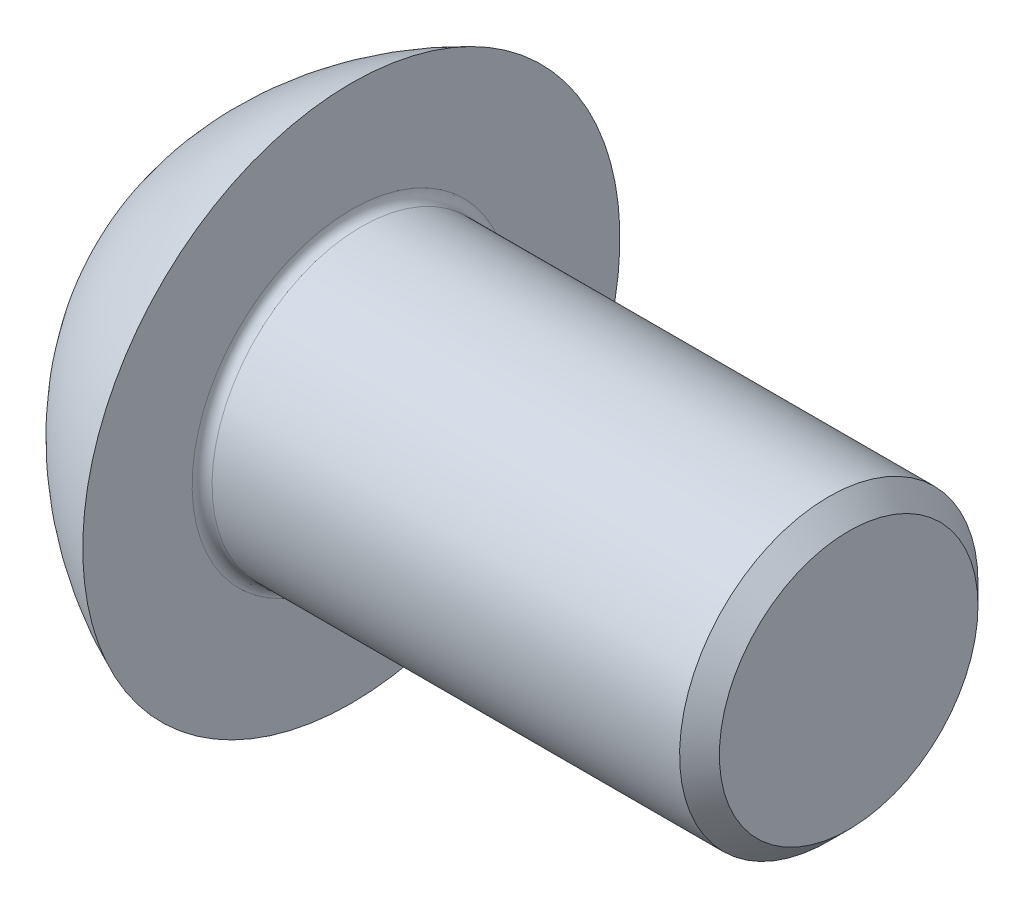
ISO-10303-21;
HEADER;
FILE_DESCRIPTION(('STEP AP214'),'2;1');
FILE_NAME('part.step','',(''),(''),'','','');
FILE_SCHEMA(('AUTOMOTIVE_DESIGN { 1 0 10303 214 1 1 1 1 }'));
ENDSEC;
DATA;
#1=APPLICATION_CONTEXT('core data for automotive mechanical design processes');
#2=APPLICATION_PROTOCOL_DEFINITION('international standard','automotive_design',2000,#1);
#3=PRODUCT_CONTEXT('',#1,'mechanical');
#4=PRODUCT('Part','Part','',(#3));
#5=PRODUCT_RELATED_PRODUCT_CATEGORY('part','',(#4));
#6=PRODUCT_DEFINITION_FORMATION('','',#4);
#7=PRODUCT_DEFINITION_CONTEXT('part definition',#1,'design');
#8=PRODUCT_DEFINITION('design','',#6,#7);
#9=PRODUCT_DEFINITION_SHAPE('','',#8);
#10=(LENGTH_UNIT() NAMED_UNIT(*) SI_UNIT(.MILLI.,.METRE.));
#11=(NAMED_UNIT(*) PLANE_ANGLE_UNIT() SI_UNIT($,.RADIAN.));
#12=(NAMED_UNIT(*) SI_UNIT($,.STERADIAN.) SOLID_ANGLE_UNIT());
#13=UNCERTAINTY_MEASURE_WITH_UNIT(LENGTH_MEASURE(1.E-05),#10,'distance_accuracy_value','');
#14=(GEOMETRIC_REPRESENTATION_CONTEXT(3) GLOBAL_UNCERTAINTY_ASSIGNED_CONTEXT((#13)) GLOBAL_UNIT_ASSIGNED_CONTEXT((#10,
#11,#12)) REPRESENTATION_CONTEXT('',''));
#15=CARTESIAN_POINT('',(0.,0.,0.));
#16=DIRECTION('',(0.,0.,1.));
#17=DIRECTION('',(1.,0.,0.));
#18=AXIS2_PLACEMENT_3D('',#15,#16,#17);
#19=CARTESIAN_POINT('',(4.5646875,0.,0.));
#20=DIRECTION('',(-1.,0.,0.));
#21=DIRECTION('',(0.,1.,0.));
#22=AXIS2_PLACEMENT_3D('',#19,#20,#21);
#23=CYLINDRICAL_SURFACE('',#22,1.5);
#24=CARTESIAN_POINT('',(6.45,0.,0.));
#25=DIRECTION('',(1.,0.,0.));
#26=DIRECTION('',(0.,0.,-1.));
#27=AXIS2_PLACEMENT_3D('',#24,#25,#26);
#28=CIRCLE('',#27,1.5);
#29=CARTESIAN_POINT('',(6.45,0.,-1.5));
#30=VERTEX_POINT('',#29);
#31=EDGE_CURVE('E11',#30,#30,#28,.F.);
#32=ORIENTED_EDGE('',*,*,#31,.T.);
#33=EDGE_LOOP('',(#32));
#34=FACE_BOUND('',#33,.T.);
#35=CARTESIAN_POINT('',(1.75,0.,0.));
#36=DIRECTION('',(1.,0.,0.));
#37=DIRECTION('',(0.,1.,0.));
#38=AXIS2_PLACEMENT_3D('',#35,#36,#37);
#39=CIRCLE('',#38,1.5);
#40=CARTESIAN_POINT('',(1.75,1.5,0.));
#41=VERTEX_POINT('',#40);
#42=EDGE_CURVE('E382',#41,#41,#39,.T.);
#43=ORIENTED_EDGE('',*,*,#42,.T.);
#44=EDGE_LOOP('',(#43));
#45=FACE_BOUND('',#44,.T.);
#46=ADVANCED_FACE('F37',(#34,#45),#23,.T.);
#47=CARTESIAN_POINT('',(-1.,-0.900666419935816,0.52));
#48=DIRECTION('',(0.,-0.866025403784439,0.5));
#49=DIRECTION('',(0.,-0.5,-0.866025403784439));
#50=AXIS2_PLACEMENT_3D('',#47,#48,#49);
#51=PLANE('',#50);
#52=DIRECTION('',(0.,-0.5,-0.866025403784439));
#53=VECTOR('',#52,1.);
#54=CARTESIAN_POINT('',(0.,-0.819416419935816,0.660729128114971));
#55=LINE('',#54,#53);
#56=CARTESIAN_POINT('',(0.,-0.600444279957211,1.04));
#57=VERTEX_POINT('',#56);
#58=CARTESIAN_POINT('',(0.,-1.20088855991442,0.));
#59=VERTEX_POINT('',#58);
#60=EDGE_CURVE('E55',#57,#59,#55,.T.);
#61=ORIENTED_EDGE('',*,*,#60,.F.);
#62=DIRECTION('',(1.,0.,0.));
#63=VECTOR('',#62,1.);
#64=CARTESIAN_POINT('',(-1.,-0.600444279957211,1.04));
#65=LINE('',#64,#63);
#66=CARTESIAN_POINT('',(1.04,-0.600444279957211,1.04));
#67=VERTEX_POINT('',#66);
#68=EDGE_CURVE('E302',#57,#67,#65,.T.);
#69=ORIENTED_EDGE('',*,*,#68,.T.);
#70=DIRECTION('',(0.,0.5,0.866025403784439));
#71=VECTOR('',#70,1.);
#72=CARTESIAN_POINT('',(1.04,-0.600444279957211,1.04));
#73=LINE('',#72,#71);
#74=CARTESIAN_POINT('',(1.04,-0.752876240745874,0.775980099216687));
#75=VERTEX_POINT('',#74);
#76=EDGE_CURVE('E361',#75,#67,#73,.T.);
#77=ORIENTED_EDGE('',*,*,#76,.F.);
#78=CARTESIAN_POINT('',(1.04,-0.752876240745875,0.775980099216688));
#79=CARTESIAN_POINT('',(1.03905947423286,-0.74357721040589,0.792086492226667));
#80=CARTESIAN_POINT('',(1.038,-0.73418518976256,0.808353949166648));
#81=(BOUNDED_CURVE() B_SPLINE_CURVE(2,(#78,#79,#80),.UNSPECIFIED.,.F.,
.F.) B_SPLINE_CURVE_WITH_KNOTS((3,3),(0.,0.0374356048378607),
.UNSPECIFIED.) CURVE() GEOMETRIC_REPRESENTATION_ITEM() RATIONAL_B_SPLINE_CURVE((1.,
1.00014797863071,1.)) REPRESENTATION_ITEM(''));
#82=CARTESIAN_POINT('',(1.038,-0.734185189762562,0.808353949166645));
#83=VERTEX_POINT('',#82);
#84=EDGE_CURVE('E241',#75,#83,#81,.T.);
#85=ORIENTED_EDGE('',*,*,#84,.T.);
#86=DIRECTION('',(0.,-0.5,-0.866025403784439));
#87=VECTOR('',#86,1.);
#88=CARTESIAN_POINT('',(1.038,-0.832416419935816,0.638212467616576));
#89=LINE('',#88,#87);
#90=CARTESIAN_POINT('',(1.038,-1.06714765010907,0.231646050833355));
#91=VERTEX_POINT('',#90);
#92=EDGE_CURVE('E234',#83,#91,#89,.T.);
#93=ORIENTED_EDGE('',*,*,#92,.T.);
#94=CARTESIAN_POINT('',(1.038,-1.06714765010907,0.231646050833352));
#95=CARTESIAN_POINT('',(1.03905947423286,-1.05775562946574,0.247913507773334));
#96=CARTESIAN_POINT('',(1.04,-1.04845659912576,0.264019900783313));
#97=(BOUNDED_CURVE() B_SPLINE_CURVE(2,(#94,#95,#96),.UNSPECIFIED.,.F.,
.F.) B_SPLINE_CURVE_WITH_KNOTS((3,3),(0.,0.0374356048378611),
.UNSPECIFIED.) CURVE() GEOMETRIC_REPRESENTATION_ITEM() RATIONAL_B_SPLINE_CURVE((1.,
1.00014797861765,1.)) REPRESENTATION_ITEM(''));
#98=CARTESIAN_POINT('',(1.04,-1.04845659912576,0.264019900783312));
#99=VERTEX_POINT('',#98);
#100=EDGE_CURVE('E229',#91,#99,#97,.T.);
#101=ORIENTED_EDGE('',*,*,#100,.T.);
#102=DIRECTION('',(0.,0.5,0.866025403784439));
#103=VECTOR('',#102,1.);
#104=CARTESIAN_POINT('',(1.04,-0.600444279957211,1.04));
#105=LINE('',#104,#103);
#106=CARTESIAN_POINT('',(1.04,-1.20088855991442,0.));
#107=VERTEX_POINT('',#106);
#108=EDGE_CURVE('E244',#107,#99,#105,.T.);
#109=ORIENTED_EDGE('',*,*,#108,.F.);
#110=DIRECTION('',(1.,0.,0.));
#111=VECTOR('',#110,1.);
#112=CARTESIAN_POINT('',(-1.,-1.20088855991442,0.));
#113=LINE('',#112,#111);
#114=EDGE_CURVE('E235',#59,#107,#113,.T.);
#115=ORIENTED_EDGE('',*,*,#114,.F.);
#116=EDGE_LOOP('',(#61,#69,#77,#85,#93,#101,#109,#115));
#117=FACE_BOUND('',#116,.T.);
#118=ADVANCED_FACE('F405',(#117),#51,.F.);
#119=CARTESIAN_POINT('',(-1.,-0.900666419935816,-0.52));
#120=DIRECTION('',(0.,-0.866025403784439,-0.5));
#121=DIRECTION('',(0.,0.5,-0.866025403784439));
#122=AXIS2_PLACEMENT_3D('',#119,#120,#121);
#123=PLANE('',#122);
#124=DIRECTION('',(0.,0.5,-0.866025403784439));
#125=VECTOR('',#124,1.);
#126=CARTESIAN_POINT('',(0.,-0.819416419935816,-0.660729128114971));
#127=LINE('',#126,#125);
#128=CARTESIAN_POINT('',(0.,-0.600444279957211,-1.04));
#129=VERTEX_POINT('',#128);
#130=EDGE_CURVE('E283',#59,#129,#127,.T.);
#131=ORIENTED_EDGE('',*,*,#130,.F.);
#132=ORIENTED_EDGE('',*,*,#114,.T.);
#133=DIRECTION('',(0.,-0.5,0.866025403784439));
#134=VECTOR('',#133,1.);
#135=CARTESIAN_POINT('',(1.04,-1.20088855991442,0.));
#136=LINE('',#135,#134);
#137=CARTESIAN_POINT('',(1.04,-1.04845659912576,-0.264019900783312));
#138=VERTEX_POINT('',#137);
#139=EDGE_CURVE('E186',#138,#107,#136,.T.);
#140=ORIENTED_EDGE('',*,*,#139,.F.);
#141=CARTESIAN_POINT('',(1.04,-1.04845659912576,-0.264019900783312));
#142=CARTESIAN_POINT('',(1.03905947423287,-1.05775562946569,-0.247913507773424));
#143=CARTESIAN_POINT('',(1.038,-1.06714765010907,-0.23164605083335));
#144=(BOUNDED_CURVE() B_SPLINE_CURVE(2,(#141,#142,#143),.UNSPECIFIED.,.F.,
.F.) B_SPLINE_CURVE_WITH_KNOTS((3,3),(0.,0.0374356048378617),
.UNSPECIFIED.) CURVE() GEOMETRIC_REPRESENTATION_ITEM() RATIONAL_B_SPLINE_CURVE((1.,
1.00014797862095,1.)) REPRESENTATION_ITEM(''));
#145=CARTESIAN_POINT('',(1.038,-1.06714765010907,-0.231646050833354));
#146=VERTEX_POINT('',#145);
#147=EDGE_CURVE('E270',#138,#146,#144,.T.);
#148=ORIENTED_EDGE('',*,*,#147,.T.);
#149=DIRECTION('',(0.,0.5,-0.866025403784439));
#150=VECTOR('',#149,1.);
#151=CARTESIAN_POINT('',(1.038,-0.832416419935816,-0.638212467616576));
#152=LINE('',#151,#150);
#153=CARTESIAN_POINT('',(1.038,-0.734185189762562,-0.808353949166645));
#154=VERTEX_POINT('',#153);
#155=EDGE_CURVE('E180',#146,#154,#152,.T.);
#156=ORIENTED_EDGE('',*,*,#155,.T.);
#157=CARTESIAN_POINT('',(1.038,-0.734185189762559,-0.808353949166649));
#158=CARTESIAN_POINT('',(1.03905947423287,-0.743577210405941,-0.792086492226576));
#159=CARTESIAN_POINT('',(1.04,-0.752876240745874,-0.775980099216688));
#160=(BOUNDED_CURVE() B_SPLINE_CURVE(2,(#157,#158,#159),.UNSPECIFIED.,.F.,
.F.) B_SPLINE_CURVE_WITH_KNOTS((3,3),(0.,0.0374356048378615),
.UNSPECIFIED.) CURVE() GEOMETRIC_REPRESENTATION_ITEM() RATIONAL_B_SPLINE_CURVE((1.,
1.00014797861121,1.)) REPRESENTATION_ITEM(''));
#161=CARTESIAN_POINT('',(1.04,-0.752876240745874,-0.775980099216688));
#162=VERTEX_POINT('',#161);
#163=EDGE_CURVE('E271',#154,#162,#160,.T.);
#164=ORIENTED_EDGE('',*,*,#163,.T.);
#165=DIRECTION('',(0.,-0.5,0.866025403784439));
#166=VECTOR('',#165,1.);
#167=CARTESIAN_POINT('',(1.04,-1.20088855991442,0.));
#168=LINE('',#167,#166);
#169=CARTESIAN_POINT('',(1.04,-0.600444279957211,-1.04));
#170=VERTEX_POINT('',#169);
#171=EDGE_CURVE('E261',#170,#162,#168,.T.);
#172=ORIENTED_EDGE('',*,*,#171,.F.);
#173=DIRECTION('',(1.,0.,0.));
#174=VECTOR('',#173,1.);
#175=CARTESIAN_POINT('',(-1.,-0.600444279957211,-1.04));
#176=LINE('',#175,#174);
#177=EDGE_CURVE('E275',#129,#170,#176,.T.);
#178=ORIENTED_EDGE('',*,*,#177,.F.);
#179=EDGE_LOOP('',(#131,#132,#140,#148,#156,#164,#172,#178));
#180=FACE_BOUND('',#179,.T.);
#181=ADVANCED_FACE('F412',(#180),#123,.F.);
#182=CARTESIAN_POINT('',(-1.,0.,-1.04));
#183=DIRECTION('',(0.,0.,-1.));
#184=DIRECTION('',(0.,1.,0.));
#185=AXIS2_PLACEMENT_3D('',#182,#183,#184);
#186=PLANE('',#185);
#187=DIRECTION('',(0.,1.,0.));
#188=VECTOR('',#187,1.);
#189=CARTESIAN_POINT('',(0.,0.325,-1.04));
#190=LINE('',#189,#188);
#191=CARTESIAN_POINT('',(0.,0.60044427995721,-1.04));
#192=VERTEX_POINT('',#191);
#193=EDGE_CURVE('E196',#129,#192,#190,.T.);
#194=ORIENTED_EDGE('',*,*,#193,.F.);
#195=ORIENTED_EDGE('',*,*,#177,.T.);
#196=DIRECTION('',(0.,-1.,0.));
#197=VECTOR('',#196,1.);
#198=CARTESIAN_POINT('',(1.04,-0.600444279957211,-1.04));
#199=LINE('',#198,#197);
#200=CARTESIAN_POINT('',(1.04,-0.295580358379884,-1.04));
#201=VERTEX_POINT('',#200);
#202=EDGE_CURVE('E124',#201,#170,#199,.T.);
#203=ORIENTED_EDGE('',*,*,#202,.F.);
#204=CARTESIAN_POINT('',(1.04,-0.295580358379884,-1.04));
#205=CARTESIAN_POINT('',(1.03905947423286,-0.314178419059819,-1.04));
#206=CARTESIAN_POINT('',(1.038,-0.332962460346514,-1.04));
#207=(BOUNDED_CURVE() B_SPLINE_CURVE(2,(#204,#205,#206),.UNSPECIFIED.,.F.,
.F.) B_SPLINE_CURVE_WITH_KNOTS((3,3),(0.,0.0374356048378617),
.UNSPECIFIED.) CURVE() GEOMETRIC_REPRESENTATION_ITEM() RATIONAL_B_SPLINE_CURVE((1.,
1.00014797861979,1.)) REPRESENTATION_ITEM(''));
#208=CARTESIAN_POINT('',(1.038,-0.332962460346509,-1.04));
#209=VERTEX_POINT('',#208);
#210=EDGE_CURVE('E277',#201,#209,#207,.T.);
#211=ORIENTED_EDGE('',*,*,#210,.T.);
#212=DIRECTION('',(0.,1.,0.));
#213=VECTOR('',#212,1.);
#214=CARTESIAN_POINT('',(1.038,0.273,-1.04));
#215=LINE('',#214,#213);
#216=CARTESIAN_POINT('',(1.038,0.332962460346509,-1.04));
#217=VERTEX_POINT('',#216);
#218=EDGE_CURVE('E134',#209,#217,#215,.T.);
#219=ORIENTED_EDGE('',*,*,#218,.T.);
#220=CARTESIAN_POINT('',(1.038,0.332962460346514,-1.04));
#221=CARTESIAN_POINT('',(1.03905947423286,0.314178419059819,-1.04));
#222=CARTESIAN_POINT('',(1.04,0.295580358379884,-1.04));
#223=(BOUNDED_CURVE() B_SPLINE_CURVE(2,(#220,#221,#222),.UNSPECIFIED.,.F.,
.F.) B_SPLINE_CURVE_WITH_KNOTS((3,3),(0.,0.0374356048378617),
.UNSPECIFIED.) CURVE() GEOMETRIC_REPRESENTATION_ITEM() RATIONAL_B_SPLINE_CURVE((1.,
1.00014797861979,1.)) REPRESENTATION_ITEM(''));
#224=CARTESIAN_POINT('',(1.04,0.295580358379884,-1.04));
#225=VERTEX_POINT('',#224);
#226=EDGE_CURVE('E205',#217,#225,#223,.T.);
#227=ORIENTED_EDGE('',*,*,#226,.T.);
#228=DIRECTION('',(0.,-1.,0.));
#229=VECTOR('',#228,1.);
#230=CARTESIAN_POINT('',(1.04,-0.600444279957211,-1.04));
#231=LINE('',#230,#229);
#232=CARTESIAN_POINT('',(1.04,0.60044427995721,-1.04));
#233=VERTEX_POINT('',#232);
#234=EDGE_CURVE('E200',#233,#225,#231,.T.);
#235=ORIENTED_EDGE('',*,*,#234,.F.);
#236=DIRECTION('',(1.,0.,0.));
#237=VECTOR('',#236,1.);
#238=CARTESIAN_POINT('',(-1.,0.60044427995721,-1.04));
#239=LINE('',#238,#237);
#240=EDGE_CURVE('E203',#192,#233,#239,.T.);
#241=ORIENTED_EDGE('',*,*,#240,.F.);
#242=EDGE_LOOP('',(#194,#195,#203,#211,#219,#227,#235,#241));
#243=FACE_BOUND('',#242,.T.);
#244=ADVANCED_FACE('F202',(#243),#186,.F.);
#245=CARTESIAN_POINT('',(-1.,0.900666419935816,-0.52));
#246=DIRECTION('',(0.,0.866025403784439,-0.5));
#247=DIRECTION('',(0.,0.5,0.866025403784439));
#248=AXIS2_PLACEMENT_3D('',#245,#246,#247);
#249=PLANE('',#248);
#250=DIRECTION('',(0.,0.5,0.866025403784439));
#251=VECTOR('',#250,1.);
#252=CARTESIAN_POINT('',(0.,0.981916419935816,-0.379270871885029));
#253=LINE('',#252,#251);
#254=CARTESIAN_POINT('',(0.,1.20088855991442,0.));
#255=VERTEX_POINT('',#254);
#256=EDGE_CURVE('E218',#192,#255,#253,.T.);
#257=ORIENTED_EDGE('',*,*,#256,.F.);
#258=ORIENTED_EDGE('',*,*,#240,.T.);
#259=DIRECTION('',(0.,-0.5,-0.866025403784439));
#260=VECTOR('',#259,1.);
#261=CARTESIAN_POINT('',(1.04,0.60044427995721,-1.04));
#262=LINE('',#261,#260);
#263=CARTESIAN_POINT('',(1.04,0.752876240745874,-0.775980099216688));
#264=VERTEX_POINT('',#263);
#265=EDGE_CURVE('E210',#264,#233,#262,.T.);
#266=ORIENTED_EDGE('',*,*,#265,.F.);
#267=CARTESIAN_POINT('',(1.04,0.752876240745876,-0.775980099216684));
#268=CARTESIAN_POINT('',(1.03905947423287,0.743577210405964,-0.792086492226539));
#269=CARTESIAN_POINT('',(1.038,0.734185189762562,-0.808353949166644));
#270=(BOUNDED_CURVE() B_SPLINE_CURVE(2,(#267,#268,#269),.UNSPECIFIED.,.F.,
.F.) B_SPLINE_CURVE_WITH_KNOTS((3,3),(0.,0.037435604837859),
.UNSPECIFIED.) CURVE() GEOMETRIC_REPRESENTATION_ITEM() RATIONAL_B_SPLINE_CURVE((1.,
1.00014797875194,1.)) REPRESENTATION_ITEM(''));
#271=CARTESIAN_POINT('',(1.038,0.734185189762561,-0.808353949166646));
#272=VERTEX_POINT('',#271);
#273=EDGE_CURVE('E219',#264,#272,#270,.T.);
#274=ORIENTED_EDGE('',*,*,#273,.T.);
#275=DIRECTION('',(0.,0.5,0.866025403784439));
#276=VECTOR('',#275,1.);
#277=CARTESIAN_POINT('',(1.038,0.968916419935816,-0.401787532383424));
#278=LINE('',#277,#276);
#279=CARTESIAN_POINT('',(1.038,1.06714765010907,-0.231646050833355));
#280=VERTEX_POINT('',#279);
#281=EDGE_CURVE('E295',#272,#280,#278,.T.);
#282=ORIENTED_EDGE('',*,*,#281,.T.);
#283=CARTESIAN_POINT('',(1.038,1.06714765010907,-0.231646050833356));
#284=CARTESIAN_POINT('',(1.03905947423287,1.05775562946567,-0.247913507773464));
#285=CARTESIAN_POINT('',(1.04,1.04845659912575,-0.264019900783316));
#286=(BOUNDED_CURVE() B_SPLINE_CURVE(2,(#283,#284,#285),.UNSPECIFIED.,.F.,
.F.) B_SPLINE_CURVE_WITH_KNOTS((3,3),(0.,0.037435604837859),
.UNSPECIFIED.) CURVE() GEOMETRIC_REPRESENTATION_ITEM() RATIONAL_B_SPLINE_CURVE((1.,
1.00014797874819,1.)) REPRESENTATION_ITEM(''));
#287=CARTESIAN_POINT('',(1.04,1.04845659912576,-0.264019900783312));
#288=VERTEX_POINT('',#287);
#289=EDGE_CURVE('E224',#280,#288,#286,.T.);
#290=ORIENTED_EDGE('',*,*,#289,.T.);
#291=DIRECTION('',(0.,-0.5,-0.866025403784439));
#292=VECTOR('',#291,1.);
#293=CARTESIAN_POINT('',(1.04,0.60044427995721,-1.04));
#294=LINE('',#293,#292);
#295=CARTESIAN_POINT('',(1.04,1.20088855991442,0.));
#296=VERTEX_POINT('',#295);
#297=EDGE_CURVE('E331',#296,#288,#294,.T.);
#298=ORIENTED_EDGE('',*,*,#297,.F.);
#299=DIRECTION('',(1.,0.,0.));
#300=VECTOR('',#299,1.);
#301=CARTESIAN_POINT('',(-1.,1.20088855991442,0.));
#302=LINE('',#301,#300);
#303=EDGE_CURVE('E250',#255,#296,#302,.T.);
#304=ORIENTED_EDGE('',*,*,#303,.F.);
#305=EDGE_LOOP('',(#257,#258,#266,#274,#282,#290,#298,#304));
#306=FACE_BOUND('',#305,.T.);
#307=ADVANCED_FACE('F214',(#306),#249,.F.);
#308=CARTESIAN_POINT('',(1.04,0.,0.));
#309=DIRECTION('',(1.,0.,0.));
#310=DIRECTION('',(0.,0.,-1.));
#311=AXIS2_PLACEMENT_3D('',#308,#309,#310);
#312=PLANE('',#311);
#313=CARTESIAN_POINT('',(1.04,0.,0.));
#314=DIRECTION('',(1.,0.,0.));
#315=DIRECTION('',(0.,1.,0.));
#316=AXIS2_PLACEMENT_3D('',#313,#314,#315);
#317=CIRCLE('',#316,1.08118811881188);
#318=EDGE_CURVE('E222',#225,#264,#317,.T.);
#319=ORIENTED_EDGE('',*,*,#318,.T.);
#320=ORIENTED_EDGE('',*,*,#265,.T.);
#321=ORIENTED_EDGE('',*,*,#234,.T.);
#322=EDGE_LOOP('',(#319,#320,#321));
#323=FACE_BOUND('',#322,.T.);
#324=ADVANCED_FACE('F221',(#323),#312,.F.);
#325=CARTESIAN_POINT('',(1.04,0.,0.));
#326=DIRECTION('',(1.,0.,0.));
#327=DIRECTION('',(0.,0.,-1.));
#328=AXIS2_PLACEMENT_3D('',#325,#326,#327);
#329=PLANE('',#328);
#330=CARTESIAN_POINT('',(1.04,0.,0.));
#331=DIRECTION('',(1.,0.,0.));
#332=DIRECTION('',(0.,1.,0.));
#333=AXIS2_PLACEMENT_3D('',#330,#331,#332);
#334=CIRCLE('',#333,1.08118811881188);
#335=EDGE_CURVE('E211',#162,#201,#334,.T.);
#336=ORIENTED_EDGE('',*,*,#335,.T.);
#337=ORIENTED_EDGE('',*,*,#202,.T.);
#338=ORIENTED_EDGE('',*,*,#171,.T.);
#339=EDGE_LOOP('',(#336,#337,#338));
#340=FACE_BOUND('',#339,.T.);
#341=ADVANCED_FACE('F436',(#340),#329,.F.);
#342=CARTESIAN_POINT('',(1.04,0.,0.));
#343=DIRECTION('',(1.,0.,0.));
#344=DIRECTION('',(0.,0.,-1.));
#345=AXIS2_PLACEMENT_3D('',#342,#343,#344);
#346=PLANE('',#345);
#347=CARTESIAN_POINT('',(1.04,0.,0.));
#348=DIRECTION('',(1.,0.,0.));
#349=DIRECTION('',(0.,1.,0.));
#350=AXIS2_PLACEMENT_3D('',#347,#348,#349);
#351=CIRCLE('',#350,1.08118811881188);
#352=EDGE_CURVE('E243',#99,#138,#351,.T.);
#353=ORIENTED_EDGE('',*,*,#352,.T.);
#354=ORIENTED_EDGE('',*,*,#139,.T.);
#355=ORIENTED_EDGE('',*,*,#108,.T.);
#356=EDGE_LOOP('',(#353,#354,#355));
#357=FACE_BOUND('',#356,.T.);
#358=ADVANCED_FACE('F433',(#357),#346,.F.);
#359=CARTESIAN_POINT('',(1.04,0.,0.));
#360=DIRECTION('',(1.,0.,0.));
#361=DIRECTION('',(0.,0.,-1.));
#362=AXIS2_PLACEMENT_3D('',#359,#360,#361);
#363=PLANE('',#362);
#364=CARTESIAN_POINT('',(1.04,0.,0.));
#365=DIRECTION('',(1.,0.,0.));
#366=DIRECTION('',(0.,1.,0.));
#367=AXIS2_PLACEMENT_3D('',#364,#365,#366);
#368=CIRCLE('',#367,1.08118811881188);
#369=CARTESIAN_POINT('',(1.04,-0.295580358379883,1.04));
#370=VERTEX_POINT('',#369);
#371=EDGE_CURVE('E286',#370,#75,#368,.T.);
#372=ORIENTED_EDGE('',*,*,#371,.T.);
#373=ORIENTED_EDGE('',*,*,#76,.T.);
#374=DIRECTION('',(0.,1.,0.));
#375=VECTOR('',#374,1.);
#376=CARTESIAN_POINT('',(1.04,0.600444279957211,1.04));
#377=LINE('',#376,#375);
#378=EDGE_CURVE('E343',#67,#370,#377,.T.);
#379=ORIENTED_EDGE('',*,*,#378,.T.);
#380=EDGE_LOOP('',(#372,#373,#379));
#381=FACE_BOUND('',#380,.T.);
#382=ADVANCED_FACE('F417',(#381),#363,.F.);
#383=CARTESIAN_POINT('',(1.04,0.,0.));
#384=DIRECTION('',(1.,0.,0.));
#385=DIRECTION('',(0.,0.,-1.));
#386=AXIS2_PLACEMENT_3D('',#383,#384,#385);
#387=PLANE('',#386);
#388=CARTESIAN_POINT('',(1.04,0.,0.));
#389=DIRECTION('',(1.,0.,0.));
#390=DIRECTION('',(0.,1.,0.));
#391=AXIS2_PLACEMENT_3D('',#388,#389,#390);
#392=CIRCLE('',#391,1.08118811881188);
#393=CARTESIAN_POINT('',(1.04,0.752876240745875,0.775980099216687));
#394=VERTEX_POINT('',#393);
#395=CARTESIAN_POINT('',(1.04,0.295580358379884,1.04));
#396=VERTEX_POINT('',#395);
#397=EDGE_CURVE('E313',#394,#396,#392,.T.);
#398=ORIENTED_EDGE('',*,*,#397,.T.);
#399=DIRECTION('',(0.,1.,0.));
#400=VECTOR('',#399,1.);
#401=CARTESIAN_POINT('',(1.04,0.600444279957211,1.04));
#402=LINE('',#401,#400);
#403=CARTESIAN_POINT('',(1.04,0.600444279957211,1.04));
#404=VERTEX_POINT('',#403);
#405=EDGE_CURVE('E281',#396,#404,#402,.T.);
#406=ORIENTED_EDGE('',*,*,#405,.T.);
#407=DIRECTION('',(0.,0.5,-0.866025403784439));
#408=VECTOR('',#407,1.);
#409=CARTESIAN_POINT('',(1.04,1.20088855991442,0.));
#410=LINE('',#409,#408);
#411=EDGE_CURVE('E278',#404,#394,#410,.T.);
#412=ORIENTED_EDGE('',*,*,#411,.T.);
#413=EDGE_LOOP('',(#398,#406,#412));
#414=FACE_BOUND('',#413,.T.);
#415=ADVANCED_FACE('F448',(#414),#387,.F.);
#416=CARTESIAN_POINT('',(1.04,0.,0.));
#417=DIRECTION('',(1.,0.,0.));
#418=DIRECTION('',(0.,0.,-1.));
#419=AXIS2_PLACEMENT_3D('',#416,#417,#418);
#420=PLANE('',#419);
#421=CARTESIAN_POINT('',(1.04,0.,0.));
#422=DIRECTION('',(1.,0.,0.));
#423=DIRECTION('',(0.,1.,0.));
#424=AXIS2_PLACEMENT_3D('',#421,#422,#423);
#425=CIRCLE('',#424,1.08118811881188);
#426=CARTESIAN_POINT('',(1.04,1.04845659912576,0.264019900783312));
#427=VERTEX_POINT('',#426);
#428=EDGE_CURVE('E282',#288,#427,#425,.T.);
#429=ORIENTED_EDGE('',*,*,#428,.T.);
#430=DIRECTION('',(0.,0.5,-0.866025403784439));
#431=VECTOR('',#430,1.);
#432=CARTESIAN_POINT('',(1.04,1.20088855991442,0.));
#433=LINE('',#432,#431);
#434=EDGE_CURVE('E300',#427,#296,#433,.T.);
#435=ORIENTED_EDGE('',*,*,#434,.T.);
#436=ORIENTED_EDGE('',*,*,#297,.T.);
#437=EDGE_LOOP('',(#429,#435,#436));
#438=FACE_BOUND('',#437,.T.);
#439=ADVANCED_FACE('F451',(#438),#420,.F.);
#440=CARTESIAN_POINT('',(-1.,0.,1.04));
#441=DIRECTION('',(0.,0.,1.));
#442=DIRECTION('',(0.,-1.,0.));
#443=AXIS2_PLACEMENT_3D('',#440,#441,#442);
#444=PLANE('',#443);
#445=DIRECTION('',(0.,-1.,0.));
#446=VECTOR('',#445,1.);
#447=CARTESIAN_POINT('',(0.,0.325,1.04));
#448=LINE('',#447,#446);
#449=CARTESIAN_POINT('',(0.,0.600444279957211,1.04));
#450=VERTEX_POINT('',#449);
#451=EDGE_CURVE('E328',#450,#57,#448,.T.);
#452=ORIENTED_EDGE('',*,*,#451,.F.);
#453=DIRECTION('',(1.,0.,0.));
#454=VECTOR('',#453,1.);
#455=CARTESIAN_POINT('',(-1.,0.600444279957211,1.04));
#456=LINE('',#455,#454);
#457=EDGE_CURVE('E333',#450,#404,#456,.T.);
#458=ORIENTED_EDGE('',*,*,#457,.T.);
#459=ORIENTED_EDGE('',*,*,#405,.F.);
#460=CARTESIAN_POINT('',(1.04,0.295580358379885,1.04));
#461=CARTESIAN_POINT('',(1.03905947423286,0.314178419059821,1.04));
#462=CARTESIAN_POINT('',(1.038,0.332962460346514,1.04));
#463=(BOUNDED_CURVE() B_SPLINE_CURVE(2,(#460,#461,#462),.UNSPECIFIED.,.F.,
.F.) B_SPLINE_CURVE_WITH_KNOTS((3,3),(0.,0.0374356048378608),
.UNSPECIFIED.) CURVE() GEOMETRIC_REPRESENTATION_ITEM() RATIONAL_B_SPLINE_CURVE((1.,
1.0001479786181,1.)) REPRESENTATION_ITEM(''));
#464=CARTESIAN_POINT('',(1.038,0.33296246034651,1.04));
#465=VERTEX_POINT('',#464);
#466=EDGE_CURVE('E340',#396,#465,#463,.T.);
#467=ORIENTED_EDGE('',*,*,#466,.T.);
#468=DIRECTION('',(0.,-1.,0.));
#469=VECTOR('',#468,1.);
#470=CARTESIAN_POINT('',(1.038,0.273,1.04));
#471=LINE('',#470,#469);
#472=CARTESIAN_POINT('',(1.038,-0.33296246034651,1.04));
#473=VERTEX_POINT('',#472);
#474=EDGE_CURVE('E260',#465,#473,#471,.T.);
#475=ORIENTED_EDGE('',*,*,#474,.T.);
#476=CARTESIAN_POINT('',(1.038,-0.332962460346514,1.04));
#477=CARTESIAN_POINT('',(1.03905947423286,-0.314178419059821,1.04));
#478=CARTESIAN_POINT('',(1.04,-0.295580358379885,1.04));
#479=(BOUNDED_CURVE() B_SPLINE_CURVE(2,(#476,#477,#478),.UNSPECIFIED.,.F.,
.F.) B_SPLINE_CURVE_WITH_KNOTS((3,3),(0.,0.0374356048378608),
.UNSPECIFIED.) CURVE() GEOMETRIC_REPRESENTATION_ITEM() RATIONAL_B_SPLINE_CURVE((1.,
1.00014797862319,1.)) REPRESENTATION_ITEM(''));
#480=EDGE_CURVE('E252',#473,#370,#479,.T.);
#481=ORIENTED_EDGE('',*,*,#480,.T.);
#482=ORIENTED_EDGE('',*,*,#378,.F.);
#483=ORIENTED_EDGE('',*,*,#68,.F.);
#484=EDGE_LOOP('',(#452,#458,#459,#467,#475,#481,#482,#483));
#485=FACE_BOUND('',#484,.T.);
#486=ADVANCED_FACE('F481',(#485),#444,.F.);
#487=CARTESIAN_POINT('',(-1.,0.900666419935816,0.52));
#488=DIRECTION('',(0.,0.866025403784439,0.5));
#489=DIRECTION('',(0.,-0.5,0.866025403784439));
#490=AXIS2_PLACEMENT_3D('',#487,#488,#489);
#491=PLANE('',#490);
#492=DIRECTION('',(0.,-0.5,0.866025403784439));
#493=VECTOR('',#492,1.);
#494=CARTESIAN_POINT('',(0.,0.981916419935816,0.379270871885029));
#495=LINE('',#494,#493);
#496=EDGE_CURVE('E316',#255,#450,#495,.T.);
#497=ORIENTED_EDGE('',*,*,#496,.F.);
#498=ORIENTED_EDGE('',*,*,#303,.T.);
#499=ORIENTED_EDGE('',*,*,#434,.F.);
#500=CARTESIAN_POINT('',(1.04,1.04845659912576,0.264019900783313));
#501=CARTESIAN_POINT('',(1.03905947423286,1.05775562946574,0.247913507773334));
#502=CARTESIAN_POINT('',(1.038,1.06714765010907,0.231646050833351));
#503=(BOUNDED_CURVE() B_SPLINE_CURVE(2,(#500,#501,#502),.UNSPECIFIED.,.F.,
.F.) B_SPLINE_CURVE_WITH_KNOTS((3,3),(0.,0.0374356048378618),
.UNSPECIFIED.) CURVE() GEOMETRIC_REPRESENTATION_ITEM() RATIONAL_B_SPLINE_CURVE((1.,
1.00014797861721,1.)) REPRESENTATION_ITEM(''));
#504=CARTESIAN_POINT('',(1.038,1.06714765010907,0.231646050833354));
#505=VERTEX_POINT('',#504);
#506=EDGE_CURVE('E245',#427,#505,#503,.T.);
#507=ORIENTED_EDGE('',*,*,#506,.T.);
#508=DIRECTION('',(0.,-0.5,0.866025403784439));
#509=VECTOR('',#508,1.);
#510=CARTESIAN_POINT('',(1.038,0.968916419935816,0.401787532383424));
#511=LINE('',#510,#509);
#512=CARTESIAN_POINT('',(1.038,0.734185189762563,0.808353949166645));
#513=VERTEX_POINT('',#512);
#514=EDGE_CURVE('E251',#505,#513,#511,.T.);
#515=ORIENTED_EDGE('',*,*,#514,.T.);
#516=CARTESIAN_POINT('',(1.038,0.734185189762561,0.808353949166648));
#517=CARTESIAN_POINT('',(1.03905947423286,0.743577210405889,0.792086492226667));
#518=CARTESIAN_POINT('',(1.04,0.752876240745875,0.775980099216687));
#519=(BOUNDED_CURVE() B_SPLINE_CURVE(2,(#516,#517,#518),.UNSPECIFIED.,.F.,
.F.) B_SPLINE_CURVE_WITH_KNOTS((3,3),(0.,0.0374356048378615),
.UNSPECIFIED.) CURVE() GEOMETRIC_REPRESENTATION_ITEM() RATIONAL_B_SPLINE_CURVE((1.,
1.00014797861975,1.)) REPRESENTATION_ITEM(''));
#520=EDGE_CURVE('E274',#513,#394,#519,.T.);
#521=ORIENTED_EDGE('',*,*,#520,.T.);
#522=ORIENTED_EDGE('',*,*,#411,.F.);
#523=ORIENTED_EDGE('',*,*,#457,.F.);
#524=EDGE_LOOP('',(#497,#498,#499,#507,#515,#521,#522,#523));
#525=FACE_BOUND('',#524,.T.);
#526=ADVANCED_FACE('F484',(#525),#491,.F.);
#527=CARTESIAN_POINT('',(1.038,0.546,0.));
#528=DIRECTION('',(-1.,0.,0.));
#529=DIRECTION('',(0.,-1.,0.));
#530=AXIS2_PLACEMENT_3D('',#527,#528,#529);
#531=PLANE('',#530);
#532=ORIENTED_EDGE('',*,*,#474,.F.);
#533=CARTESIAN_POINT('',(1.038,0.,0.));
#534=DIRECTION('',(1.,0.,0.));
#535=DIRECTION('',(0.,1.,0.));
#536=AXIS2_PLACEMENT_3D('',#533,#534,#535);
#537=CIRCLE('',#536,1.092);
#538=EDGE_CURVE('E320',#465,#473,#537,.T.);
#539=ORIENTED_EDGE('',*,*,#538,.T.);
#540=EDGE_LOOP('',(#532,#539));
#541=FACE_BOUND('',#540,.T.);
#542=ADVANCED_FACE('F454',(#541),#531,.F.);
#543=CARTESIAN_POINT('',(1.038,0.546,0.));
#544=DIRECTION('',(-1.,0.,0.));
#545=DIRECTION('',(0.,-1.,0.));
#546=AXIS2_PLACEMENT_3D('',#543,#544,#545);
#547=PLANE('',#546);
#548=ORIENTED_EDGE('',*,*,#92,.F.);
#549=CARTESIAN_POINT('',(1.038,0.,0.));
#550=DIRECTION('',(1.,0.,0.));
#551=DIRECTION('',(0.,1.,0.));
#552=AXIS2_PLACEMENT_3D('',#549,#550,#551);
#553=CIRCLE('',#552,1.092);
#554=EDGE_CURVE('E317',#83,#91,#553,.T.);
#555=ORIENTED_EDGE('',*,*,#554,.T.);
#556=EDGE_LOOP('',(#548,#555));
#557=FACE_BOUND('',#556,.T.);
#558=ADVANCED_FACE('F447',(#557),#547,.F.);
#559=CARTESIAN_POINT('',(1.038,0.546,0.));
#560=DIRECTION('',(-1.,0.,0.));
#561=DIRECTION('',(0.,-1.,0.));
#562=AXIS2_PLACEMENT_3D('',#559,#560,#561);
#563=PLANE('',#562);
#564=ORIENTED_EDGE('',*,*,#155,.F.);
#565=CARTESIAN_POINT('',(1.038,0.,0.));
#566=DIRECTION('',(1.,0.,0.));
#567=DIRECTION('',(0.,1.,0.));
#568=AXIS2_PLACEMENT_3D('',#565,#566,#567);
#569=CIRCLE('',#568,1.092);
#570=EDGE_CURVE('E321',#146,#154,#569,.T.);
#571=ORIENTED_EDGE('',*,*,#570,.T.);
#572=EDGE_LOOP('',(#564,#571));
#573=FACE_BOUND('',#572,.T.);
#574=ADVANCED_FACE('F444',(#573),#563,.F.);
#575=CARTESIAN_POINT('',(1.038,0.546,0.));
#576=DIRECTION('',(-1.,0.,0.));
#577=DIRECTION('',(0.,-1.,0.));
#578=AXIS2_PLACEMENT_3D('',#575,#576,#577);
#579=PLANE('',#578);
#580=ORIENTED_EDGE('',*,*,#218,.F.);
#581=CARTESIAN_POINT('',(1.038,0.,0.));
#582=DIRECTION('',(1.,0.,0.));
#583=DIRECTION('',(0.,1.,0.));
#584=AXIS2_PLACEMENT_3D('',#581,#582,#583);
#585=CIRCLE('',#584,1.092);
#586=EDGE_CURVE('E324',#209,#217,#585,.T.);
#587=ORIENTED_EDGE('',*,*,#586,.T.);
#588=EDGE_LOOP('',(#580,#587));
#589=FACE_BOUND('',#588,.T.);
#590=ADVANCED_FACE('F423',(#589),#579,.F.);
#591=CARTESIAN_POINT('',(1.038,0.546,0.));
#592=DIRECTION('',(-1.,0.,0.));
#593=DIRECTION('',(0.,-1.,0.));
#594=AXIS2_PLACEMENT_3D('',#591,#592,#593);
#595=PLANE('',#594);
#596=ORIENTED_EDGE('',*,*,#281,.F.);
#597=CARTESIAN_POINT('',(1.038,0.,0.));
#598=DIRECTION('',(1.,0.,0.));
#599=DIRECTION('',(0.,1.,0.));
#600=AXIS2_PLACEMENT_3D('',#597,#598,#599);
#601=CIRCLE('',#600,1.092);
#602=EDGE_CURVE('E364',#272,#280,#601,.T.);
#603=ORIENTED_EDGE('',*,*,#602,.T.);
#604=EDGE_LOOP('',(#596,#603));
#605=FACE_BOUND('',#604,.T.);
#606=ADVANCED_FACE('F419',(#605),#595,.F.);
#607=CARTESIAN_POINT('',(1.038,0.546,0.));
#608=DIRECTION('',(-1.,0.,0.));
#609=DIRECTION('',(0.,-1.,0.));
#610=AXIS2_PLACEMENT_3D('',#607,#608,#609);
#611=PLANE('',#610);
#612=ORIENTED_EDGE('',*,*,#514,.F.);
#613=CARTESIAN_POINT('',(1.038,0.,0.));
#614=DIRECTION('',(1.,0.,0.));
#615=DIRECTION('',(0.,1.,0.));
#616=AXIS2_PLACEMENT_3D('',#613,#614,#615);
#617=CIRCLE('',#616,1.092);
#618=EDGE_CURVE('E315',#505,#513,#617,.T.);
#619=ORIENTED_EDGE('',*,*,#618,.T.);
#620=EDGE_LOOP('',(#612,#619));
#621=FACE_BOUND('',#620,.T.);
#622=ADVANCED_FACE('F422',(#621),#611,.F.);
#623=CARTESIAN_POINT('',(1.139,0.,0.));
#624=DIRECTION('',(-1.,0.,0.));
#625=DIRECTION('',(0.,1.,0.));
#626=AXIS2_PLACEMENT_3D('',#623,#624,#625);
#627=CONICAL_SURFACE('',#626,0.546,1.38788226954824);
#628=ORIENTED_EDGE('',*,*,#506,.F.);
#629=ORIENTED_EDGE('',*,*,#428,.F.);
#630=ORIENTED_EDGE('',*,*,#289,.F.);
#631=ORIENTED_EDGE('',*,*,#602,.F.);
#632=ORIENTED_EDGE('',*,*,#273,.F.);
#633=ORIENTED_EDGE('',*,*,#318,.F.);
#634=ORIENTED_EDGE('',*,*,#226,.F.);
#635=ORIENTED_EDGE('',*,*,#586,.F.);
#636=ORIENTED_EDGE('',*,*,#210,.F.);
#637=ORIENTED_EDGE('',*,*,#335,.F.);
#638=ORIENTED_EDGE('',*,*,#163,.F.);
#639=ORIENTED_EDGE('',*,*,#570,.F.);
#640=ORIENTED_EDGE('',*,*,#147,.F.);
#641=ORIENTED_EDGE('',*,*,#352,.F.);
#642=ORIENTED_EDGE('',*,*,#100,.F.);
#643=ORIENTED_EDGE('',*,*,#554,.F.);
#644=ORIENTED_EDGE('',*,*,#84,.F.);
#645=ORIENTED_EDGE('',*,*,#371,.F.);
#646=ORIENTED_EDGE('',*,*,#480,.F.);
#647=ORIENTED_EDGE('',*,*,#538,.F.);
#648=ORIENTED_EDGE('',*,*,#466,.F.);
#649=ORIENTED_EDGE('',*,*,#397,.F.);
#650=ORIENTED_EDGE('',*,*,#520,.F.);
#651=ORIENTED_EDGE('',*,*,#618,.F.);
#652=EDGE_LOOP('',(#628,#629,#630,#631,#632,#633,#634,#635,#636,#637,#638,#639,#640,#641,#642,
#643,#644,#645,#646,#647,#648,#649,#650,#651));
#653=FACE_BOUND('',#652,.T.);
#654=CARTESIAN_POINT('',(1.24,0.,0.));
#655=VERTEX_POINT('',#654);
#656=VERTEX_LOOP('',#655);
#657=FACE_BOUND('',#656,.T.);
#658=ADVANCED_FACE('F440',(#653,#657),#627,.F.);
#659=CARTESIAN_POINT('',(0.,0.65,0.));
#660=DIRECTION('',(-1.,0.,0.));
#661=DIRECTION('',(0.,-1.,0.));
#662=AXIS2_PLACEMENT_3D('',#659,#660,#661);
#663=PLANE('',#662);
#664=ORIENTED_EDGE('',*,*,#256,.T.);
#665=ORIENTED_EDGE('',*,*,#496,.T.);
#666=ORIENTED_EDGE('',*,*,#451,.T.);
#667=ORIENTED_EDGE('',*,*,#60,.T.);
#668=ORIENTED_EDGE('',*,*,#130,.T.);
#669=ORIENTED_EDGE('',*,*,#193,.T.);
#670=EDGE_LOOP('',(#664,#665,#666,#667,#668,#669));
#671=FACE_BOUND('',#670,.T.);
#672=CARTESIAN_POINT('',(0.,0.,0.));
#673=DIRECTION('',(1.,0.,0.));
#674=DIRECTION('',(0.,1.,0.));
#675=AXIS2_PLACEMENT_3D('',#672,#673,#674);
#676=CIRCLE('',#675,1.3);
#677=CARTESIAN_POINT('',(0.,1.3,0.));
#678=VERTEX_POINT('',#677);
#679=EDGE_CURVE('E266',#678,#678,#676,.T.);
#680=ORIENTED_EDGE('',*,*,#679,.F.);
#681=EDGE_LOOP('',(#680));
#682=FACE_BOUND('',#681,.T.);
#683=ADVANCED_FACE('F432',(#671,#682),#663,.T.);
#684=CARTESIAN_POINT('',(3.1141827613574,0.,0.));
#685=DIRECTION('',(1.,0.,0.));
#686=DIRECTION('',(0.,0.,1.));
#687=AXIS2_PLACEMENT_3D('',#684,#685,#686);
#688=DEGENERATE_TOROIDAL_SURFACE('',#687,0.697965397314078,3.7,.F.);
#689=CARTESIAN_POINT('',(1.65,0.,0.));
#690=DIRECTION('',(1.,0.,0.));
#691=DIRECTION('',(0.,1.,0.));
#692=AXIS2_PLACEMENT_3D('',#689,#690,#691);
#693=CIRCLE('',#692,2.7);
#694=CARTESIAN_POINT('',(1.65,2.7,0.));
#695=VERTEX_POINT('',#694);
#696=EDGE_CURVE('E82',#695,#695,#693,.T.);
#697=ORIENTED_EDGE('',*,*,#696,.F.);
#698=EDGE_LOOP('',(#697));
#699=FACE_BOUND('',#698,.T.);
#700=ORIENTED_EDGE('',*,*,#679,.T.);
#701=EDGE_LOOP('',(#700));
#702=FACE_BOUND('',#701,.T.);
#703=ADVANCED_FACE('F429',(#699,#702),#688,.F.);
#704=CARTESIAN_POINT('',(1.65,2.15,0.));
#705=DIRECTION('',(1.,0.,0.));
#706=DIRECTION('',(0.,1.,0.));
#707=AXIS2_PLACEMENT_3D('',#704,#705,#706);
#708=PLANE('',#707);
#709=CARTESIAN_POINT('',(1.65,0.,0.));
#710=DIRECTION('',(1.,0.,0.));
#711=DIRECTION('',(0.,1.,0.));
#712=AXIS2_PLACEMENT_3D('',#709,#710,#711);
#713=CIRCLE('',#712,1.6);
#714=CARTESIAN_POINT('',(1.65,1.6,0.));
#715=VERTEX_POINT('',#714);
#716=EDGE_CURVE('E90',#715,#715,#713,.T.);
#717=ORIENTED_EDGE('',*,*,#716,.F.);
#718=EDGE_LOOP('',(#717));
#719=FACE_BOUND('',#718,.T.);
#720=ORIENTED_EDGE('',*,*,#696,.T.);
#721=EDGE_LOOP('',(#720));
#722=FACE_BOUND('',#721,.T.);
#723=ADVANCED_FACE('F427',(#719,#722),#708,.T.);
#724=CARTESIAN_POINT('',(1.75,0.,0.));
#725=DIRECTION('',(1.,0.,0.));
#726=DIRECTION('',(0.,0.,-1.));
#727=AXIS2_PLACEMENT_3D('',#724,#725,#726);
#728=TOROIDAL_SURFACE('',#727,1.6,0.1);
#729=ORIENTED_EDGE('',*,*,#42,.F.);
#730=EDGE_LOOP('',(#729));
#731=FACE_BOUND('',#730,.T.);
#732=ORIENTED_EDGE('',*,*,#716,.T.);
#733=EDGE_LOOP('',(#732));
#734=FACE_BOUND('',#733,.T.);
#735=ADVANCED_FACE('F401',(#731,#734),#728,.F.);
#736=CARTESIAN_POINT('',(6.65,0.,0.));
#737=DIRECTION('',(1.,0.,0.));
#738=DIRECTION('',(0.,0.,-1.));
#739=AXIS2_PLACEMENT_3D('',#736,#737,#738);
#740=PLANE('',#739);
#741=CARTESIAN_POINT('',(6.65,0.,0.));
#742=DIRECTION('',(1.,0.,0.));
#743=DIRECTION('',(0.,0.,-1.));
#744=AXIS2_PLACEMENT_3D('',#741,#742,#743);
#745=CIRCLE('',#744,1.3);
#746=CARTESIAN_POINT('',(6.65,0.,-1.3));
#747=VERTEX_POINT('',#746);
#748=EDGE_CURVE('E47',#747,#747,#745,.T.);
#749=ORIENTED_EDGE('',*,*,#748,.T.);
#750=EDGE_LOOP('',(#749));
#751=FACE_BOUND('',#750,.T.);
#752=ADVANCED_FACE('F393',(#751),#740,.T.);
#753=CARTESIAN_POINT('',(6.65,0.,0.));
#754=DIRECTION('',(-1.,0.,0.));
#755=DIRECTION('',(0.,0.,1.));
#756=AXIS2_PLACEMENT_3D('',#753,#754,#755);
#757=CONICAL_SURFACE('',#756,1.3,0.785398163397448);
#758=ORIENTED_EDGE('',*,*,#31,.F.);
#759=EDGE_LOOP('',(#758));
#760=FACE_BOUND('',#759,.T.);
#761=ORIENTED_EDGE('',*,*,#748,.F.);
#762=EDGE_LOOP('',(#761));
#763=FACE_BOUND('',#762,.T.);
#764=ADVANCED_FACE('F40',(#760,#763),#757,.T.);
#765=CLOSED_SHELL('',(#46,#118,#181,#244,#307,#324,#341,#358,#382,#415,#439,#486,#526,#542,#558,
#574,#590,#606,#622,#658,#683,#703,#723,#735,#752,#764));
#766=MANIFOLD_SOLID_BREP('B2',#765);
#767=ADVANCED_BREP_SHAPE_REPRESENTATION('',(#18,#766),#14);
#768=SHAPE_DEFINITION_REPRESENTATION(#9,#767);
ENDSEC;
END-ISO-10303-21;
